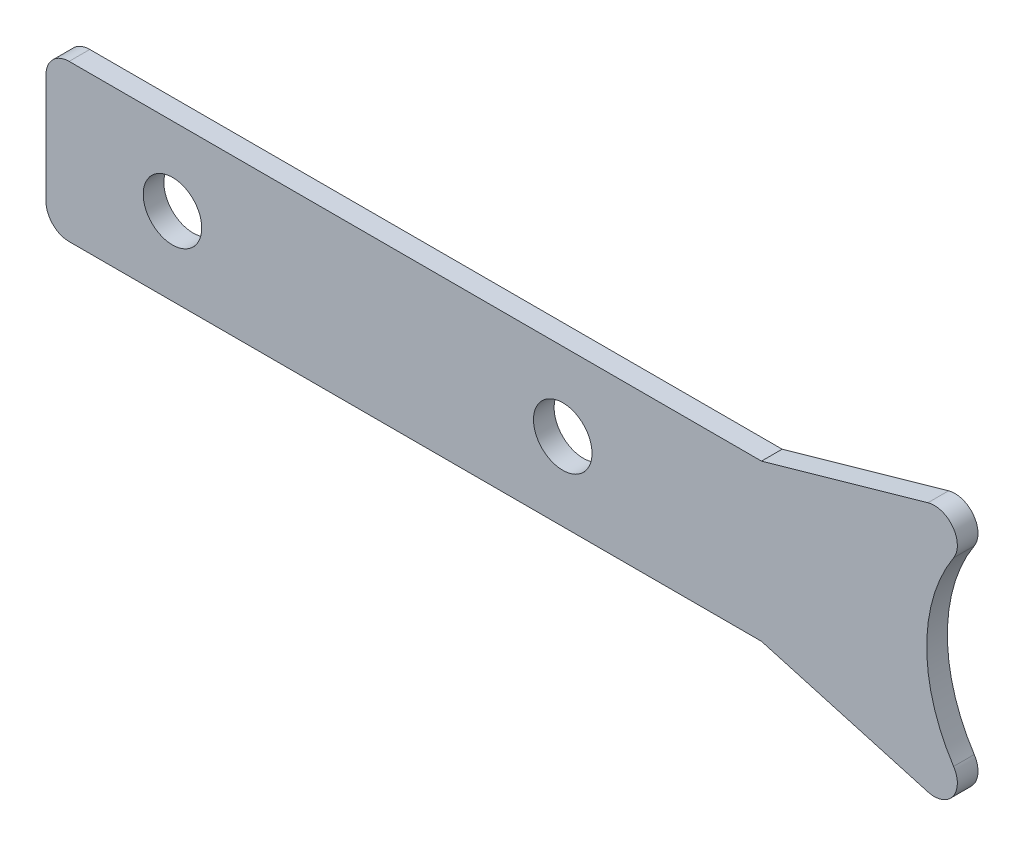
ISO-10303-21;
HEADER;
FILE_DESCRIPTION(('STEP AP214'),'2;1');
FILE_NAME('part.step','',(''),(''),'','','');
FILE_SCHEMA(('AUTOMOTIVE_DESIGN { 1 0 10303 214 1 1 1 1 }'));
ENDSEC;
DATA;
#1=APPLICATION_CONTEXT('core data for automotive mechanical design processes');
#2=APPLICATION_PROTOCOL_DEFINITION('international standard','automotive_design',2000,#1);
#3=PRODUCT_CONTEXT('',#1,'mechanical');
#4=PRODUCT('Part','Part','',(#3));
#5=PRODUCT_RELATED_PRODUCT_CATEGORY('part','',(#4));
#6=PRODUCT_DEFINITION_FORMATION('','',#4);
#7=PRODUCT_DEFINITION_CONTEXT('part definition',#1,'design');
#8=PRODUCT_DEFINITION('design','',#6,#7);
#9=PRODUCT_DEFINITION_SHAPE('','',#8);
#10=(LENGTH_UNIT() NAMED_UNIT(*) SI_UNIT(.MILLI.,.METRE.));
#11=(NAMED_UNIT(*) PLANE_ANGLE_UNIT() SI_UNIT($,.RADIAN.));
#12=(NAMED_UNIT(*) SI_UNIT($,.STERADIAN.) SOLID_ANGLE_UNIT());
#13=UNCERTAINTY_MEASURE_WITH_UNIT(LENGTH_MEASURE(1.E-05),#10,'distance_accuracy_value','');
#14=(GEOMETRIC_REPRESENTATION_CONTEXT(3) GLOBAL_UNCERTAINTY_ASSIGNED_CONTEXT((#13)) GLOBAL_UNIT_ASSIGNED_CONTEXT((#10,
#11,#12)) REPRESENTATION_CONTEXT('',''));
#15=CARTESIAN_POINT('',(0.,0.,0.));
#16=DIRECTION('',(0.,0.,1.));
#17=DIRECTION('',(1.,0.,0.));
#18=AXIS2_PLACEMENT_3D('',#15,#16,#17);
#19=CARTESIAN_POINT('',(0.,-5.99999999999999,1.5875));
#20=DIRECTION('',(0.,1.,0.));
#21=DIRECTION('',(-1.,0.,0.));
#22=AXIS2_PLACEMENT_3D('',#19,#20,#21);
#23=PLANE('',#22);
#24=DIRECTION('',(1.,0.,0.));
#25=VECTOR('',#24,1.);
#26=CARTESIAN_POINT('',(0.,-5.99999999999999,1.5875));
#27=LINE('',#26,#25);
#28=CARTESIAN_POINT('',(-25.722,-5.99999999999999,1.5875));
#29=VERTEX_POINT('',#28);
#30=CARTESIAN_POINT('',(27.5,-5.99999999999999,1.5875));
#31=VERTEX_POINT('',#30);
#32=EDGE_CURVE('E118',#29,#31,#27,.T.);
#33=ORIENTED_EDGE('',*,*,#32,.F.);
#34=DIRECTION('',(0.,0.,-1.));
#35=VECTOR('',#34,1.);
#36=CARTESIAN_POINT('',(-25.722,-5.99999999999999,1.5875));
#37=LINE('',#36,#35);
#38=CARTESIAN_POINT('',(-25.722,-5.99999999999999,0.));
#39=VERTEX_POINT('',#38);
#40=EDGE_CURVE('E170',#29,#39,#37,.T.);
#41=ORIENTED_EDGE('',*,*,#40,.T.);
#42=DIRECTION('',(1.,0.,0.));
#43=VECTOR('',#42,1.);
#44=CARTESIAN_POINT('',(0.,-5.99999999999999,0.));
#45=LINE('',#44,#43);
#46=CARTESIAN_POINT('',(27.5,-5.99999999999999,0.));
#47=VERTEX_POINT('',#46);
#48=EDGE_CURVE('E141',#39,#47,#45,.T.);
#49=ORIENTED_EDGE('',*,*,#48,.T.);
#50=DIRECTION('',(0.,0.,-1.));
#51=VECTOR('',#50,1.);
#52=CARTESIAN_POINT('',(27.5,-5.99999999999999,1.5875));
#53=LINE('',#52,#51);
#54=EDGE_CURVE('E136',#31,#47,#53,.T.);
#55=ORIENTED_EDGE('',*,*,#54,.F.);
#56=EDGE_LOOP('',(#33,#41,#49,#55));
#57=FACE_BOUND('',#56,.T.);
#58=ADVANCED_FACE('F41',(#57),#23,.F.);
#59=CARTESIAN_POINT('',(0.471196369912485,1.66217483086752,1.5875));
#60=DIRECTION('',(0.272734823959904,0.962089245236407,0.));
#61=DIRECTION('',(-0.962089245236408,0.272734823959904,0.));
#62=AXIS2_PLACEMENT_3D('',#59,#60,#61);
#63=PLANE('',#62);
#64=DIRECTION('',(0.962089245236407,-0.272734823959904,0.));
#65=VECTOR('',#64,1.);
#66=CARTESIAN_POINT('',(0.471196369912485,1.66217483086752,0.));
#67=LINE('',#66,#65);
#68=CARTESIAN_POINT('',(40.2927545745257,-9.62651353200419,0.));
#69=VERTEX_POINT('',#68);
#70=EDGE_CURVE('E189',#47,#69,#67,.T.);
#71=ORIENTED_EDGE('',*,*,#70,.T.);
#72=DIRECTION('',(0.,0.,1.));
#73=VECTOR('',#72,1.);
#74=CARTESIAN_POINT('',(40.2927545745257,-9.62651353200419,1.5875));
#75=LINE('',#74,#73);
#76=CARTESIAN_POINT('',(40.2927545745257,-9.62651353200419,1.5875));
#77=VERTEX_POINT('',#76);
#78=EDGE_CURVE('E49',#69,#77,#75,.T.);
#79=ORIENTED_EDGE('',*,*,#78,.T.);
#80=DIRECTION('',(0.962089245236407,-0.272734823959904,0.));
#81=VECTOR('',#80,1.);
#82=CARTESIAN_POINT('',(0.471196369912485,1.66217483086752,1.5875));
#83=LINE('',#82,#81);
#84=EDGE_CURVE('E122',#31,#77,#83,.T.);
#85=ORIENTED_EDGE('',*,*,#84,.F.);
#86=ORIENTED_EDGE('',*,*,#54,.T.);
#87=EDGE_LOOP('',(#71,#79,#85,#86));
#88=FACE_BOUND('',#87,.T.);
#89=ADVANCED_FACE('F135',(#88),#63,.F.);
#90=CARTESIAN_POINT('',(52.9,0.,1.5875));
#91=DIRECTION('',(0.,0.,-1.));
#92=DIRECTION('',(-1.,0.,0.));
#93=AXIS2_PLACEMENT_3D('',#90,#91,#92);
#94=CYLINDRICAL_SURFACE('',#93,12.7);
#95=CARTESIAN_POINT('',(52.9,0.,1.5875));
#96=DIRECTION('',(0.,0.,1.));
#97=DIRECTION('',(1.,0.,0.));
#98=AXIS2_PLACEMENT_3D('',#95,#96,#97);
#99=CIRCLE('',#98,12.7);
#100=CARTESIAN_POINT('',(42.2663834136197,6.94378846839813,1.5875));
#101=VERTEX_POINT('',#100);
#102=CARTESIAN_POINT('',(42.2663834136197,-6.94378846839812,1.5875));
#103=VERTEX_POINT('',#102);
#104=EDGE_CURVE('E138',#101,#103,#99,.T.);
#105=ORIENTED_EDGE('',*,*,#104,.T.);
#106=DIRECTION('',(0.,0.,-1.));
#107=VECTOR('',#106,1.);
#108=CARTESIAN_POINT('',(42.2663834136197,-6.94378846839812,1.5875));
#109=LINE('',#108,#107);
#110=CARTESIAN_POINT('',(42.2663834136197,-6.94378846839812,0.));
#111=VERTEX_POINT('',#110);
#112=EDGE_CURVE('E174',#103,#111,#109,.T.);
#113=ORIENTED_EDGE('',*,*,#112,.T.);
#114=CARTESIAN_POINT('',(52.9,0.,0.));
#115=DIRECTION('',(0.,0.,1.));
#116=DIRECTION('',(1.,0.,0.));
#117=AXIS2_PLACEMENT_3D('',#114,#115,#116);
#118=CIRCLE('',#117,12.7);
#119=CARTESIAN_POINT('',(42.2663834136197,6.94378846839813,0.));
#120=VERTEX_POINT('',#119);
#121=EDGE_CURVE('E181',#120,#111,#118,.T.);
#122=ORIENTED_EDGE('',*,*,#121,.F.);
#123=DIRECTION('',(0.,0.,-1.));
#124=VECTOR('',#123,1.);
#125=CARTESIAN_POINT('',(42.2663834136197,6.94378846839812,1.5875));
#126=LINE('',#125,#124);
#127=EDGE_CURVE('E172',#120,#101,#126,.F.);
#128=ORIENTED_EDGE('',*,*,#127,.T.);
#129=EDGE_LOOP('',(#105,#113,#122,#128));
#130=FACE_BOUND('',#129,.T.);
#131=ADVANCED_FACE('F180',(#130),#94,.F.);
#132=CARTESIAN_POINT('',(0.471196369912486,-1.66217483086753,1.5875));
#133=DIRECTION('',(-0.272734823959904,0.962089245236407,0.));
#134=DIRECTION('',(-0.962089245236408,-0.272734823959904,0.));
#135=AXIS2_PLACEMENT_3D('',#132,#133,#134);
#136=PLANE('',#135);
#137=DIRECTION('',(0.962089245236407,0.272734823959904,0.));
#138=VECTOR('',#137,1.);
#139=CARTESIAN_POINT('',(0.471196369912486,-1.66217483086753,1.5875));
#140=LINE('',#139,#138);
#141=CARTESIAN_POINT('',(27.5,5.99999999999999,1.5875));
#142=VERTEX_POINT('',#141);
#143=CARTESIAN_POINT('',(40.2927545745257,9.62651353200419,1.5875));
#144=VERTEX_POINT('',#143);
#145=EDGE_CURVE('E212',#142,#144,#140,.T.);
#146=ORIENTED_EDGE('',*,*,#145,.T.);
#147=DIRECTION('',(0.,0.,-1.));
#148=VECTOR('',#147,1.);
#149=CARTESIAN_POINT('',(40.2927545745257,9.62651353200419,1.5875));
#150=LINE('',#149,#148);
#151=CARTESIAN_POINT('',(40.2927545745257,9.62651353200419,0.));
#152=VERTEX_POINT('',#151);
#153=EDGE_CURVE('E11',#144,#152,#150,.T.);
#154=ORIENTED_EDGE('',*,*,#153,.T.);
#155=DIRECTION('',(0.962089245236407,0.272734823959904,0.));
#156=VECTOR('',#155,1.);
#157=CARTESIAN_POINT('',(0.471196369912486,-1.66217483086753,0.));
#158=LINE('',#157,#156);
#159=CARTESIAN_POINT('',(27.5,5.99999999999999,0.));
#160=VERTEX_POINT('',#159);
#161=EDGE_CURVE('E188',#160,#152,#158,.T.);
#162=ORIENTED_EDGE('',*,*,#161,.F.);
#163=DIRECTION('',(0.,0.,-1.));
#164=VECTOR('',#163,1.);
#165=CARTESIAN_POINT('',(27.5,5.99999999999999,1.5875));
#166=LINE('',#165,#164);
#167=EDGE_CURVE('E144',#142,#160,#166,.T.);
#168=ORIENTED_EDGE('',*,*,#167,.F.);
#169=EDGE_LOOP('',(#146,#154,#162,#168));
#170=FACE_BOUND('',#169,.T.);
#171=ADVANCED_FACE('F320',(#170),#136,.T.);
#172=CARTESIAN_POINT('',(0.,6.,1.5875));
#173=DIRECTION('',(0.,1.,0.));
#174=DIRECTION('',(-1.,0.,0.));
#175=AXIS2_PLACEMENT_3D('',#172,#173,#174);
#176=PLANE('',#175);
#177=DIRECTION('',(1.,0.,0.));
#178=VECTOR('',#177,1.);
#179=CARTESIAN_POINT('',(0.,6.,0.));
#180=LINE('',#179,#178);
#181=CARTESIAN_POINT('',(-25.722,6.00000000000001,0.));
#182=VERTEX_POINT('',#181);
#183=EDGE_CURVE('E191',#182,#160,#180,.T.);
#184=ORIENTED_EDGE('',*,*,#183,.F.);
#185=DIRECTION('',(0.,0.,-1.));
#186=VECTOR('',#185,1.);
#187=CARTESIAN_POINT('',(-25.722,6.00000000000001,1.5875));
#188=LINE('',#187,#186);
#189=CARTESIAN_POINT('',(-25.722,6.00000000000001,1.5875));
#190=VERTEX_POINT('',#189);
#191=EDGE_CURVE('E163',#182,#190,#188,.F.);
#192=ORIENTED_EDGE('',*,*,#191,.T.);
#193=DIRECTION('',(1.,0.,0.));
#194=VECTOR('',#193,1.);
#195=CARTESIAN_POINT('',(0.,6.,1.5875));
#196=LINE('',#195,#194);
#197=EDGE_CURVE('E210',#190,#142,#196,.T.);
#198=ORIENTED_EDGE('',*,*,#197,.T.);
#199=ORIENTED_EDGE('',*,*,#167,.T.);
#200=EDGE_LOOP('',(#184,#192,#198,#199));
#201=FACE_BOUND('',#200,.T.);
#202=ADVANCED_FACE('F312',(#201),#176,.T.);
#203=CARTESIAN_POINT('',(-27.5,0.,1.5875));
#204=DIRECTION('',(1.,0.,0.));
#205=DIRECTION('',(0.,1.,0.));
#206=AXIS2_PLACEMENT_3D('',#203,#204,#205);
#207=PLANE('',#206);
#208=DIRECTION('',(0.,-1.,0.));
#209=VECTOR('',#208,1.);
#210=CARTESIAN_POINT('',(-27.5,0.,1.5875));
#211=LINE('',#210,#209);
#212=CARTESIAN_POINT('',(-27.5,4.22200000000001,1.5875));
#213=VERTEX_POINT('',#212);
#214=CARTESIAN_POINT('',(-27.5,-4.22199999999999,1.5875));
#215=VERTEX_POINT('',#214);
#216=EDGE_CURVE('E149',#213,#215,#211,.T.);
#217=ORIENTED_EDGE('',*,*,#216,.F.);
#218=DIRECTION('',(0.,0.,-1.));
#219=VECTOR('',#218,1.);
#220=CARTESIAN_POINT('',(-27.5,4.22200000000001,0.));
#221=LINE('',#220,#219);
#222=CARTESIAN_POINT('',(-27.5,4.22200000000001,0.));
#223=VERTEX_POINT('',#222);
#224=EDGE_CURVE('E146',#213,#223,#221,.T.);
#225=ORIENTED_EDGE('',*,*,#224,.T.);
#226=DIRECTION('',(0.,-1.,0.));
#227=VECTOR('',#226,1.);
#228=CARTESIAN_POINT('',(-27.5,0.,0.));
#229=LINE('',#228,#227);
#230=CARTESIAN_POINT('',(-27.5,-4.22199999999999,0.));
#231=VERTEX_POINT('',#230);
#232=EDGE_CURVE('E130',#223,#231,#229,.T.);
#233=ORIENTED_EDGE('',*,*,#232,.T.);
#234=DIRECTION('',(0.,0.,-1.));
#235=VECTOR('',#234,1.);
#236=CARTESIAN_POINT('',(-27.5,-4.22199999999999,1.5875));
#237=LINE('',#236,#235);
#238=EDGE_CURVE('E143',#231,#215,#237,.F.);
#239=ORIENTED_EDGE('',*,*,#238,.T.);
#240=EDGE_LOOP('',(#217,#225,#233,#239));
#241=FACE_BOUND('',#240,.T.);
#242=ADVANCED_FACE('F200',(#241),#207,.F.);
#243=CARTESIAN_POINT('',(0.,0.,1.5875));
#244=DIRECTION('',(0.,0.,1.));
#245=DIRECTION('',(1.,0.,0.));
#246=AXIS2_PLACEMENT_3D('',#243,#244,#245);
#247=PLANE('',#246);
#248=CARTESIAN_POINT('',(-17.778,0.,1.5875));
#249=DIRECTION('',(0.,0.,1.));
#250=DIRECTION('',(1.,0.,0.));
#251=AXIS2_PLACEMENT_3D('',#248,#249,#250);
#252=CIRCLE('',#251,2.25);
#253=CARTESIAN_POINT('',(-15.528,0.,1.5875));
#254=VERTEX_POINT('',#253);
#255=EDGE_CURVE('E220',#254,#254,#252,.T.);
#256=ORIENTED_EDGE('',*,*,#255,.F.);
#257=EDGE_LOOP('',(#256));
#258=FACE_BOUND('',#257,.T.);
#259=CARTESIAN_POINT('',(12.2216508138959,0.,1.5875));
#260=DIRECTION('',(0.,0.,1.));
#261=DIRECTION('',(1.,0.,0.));
#262=AXIS2_PLACEMENT_3D('',#259,#260,#261);
#263=CIRCLE('',#262,2.25);
#264=CARTESIAN_POINT('',(14.4716508138959,0.,1.5875));
#265=VERTEX_POINT('',#264);
#266=EDGE_CURVE('E206',#265,#265,#263,.T.);
#267=ORIENTED_EDGE('',*,*,#266,.F.);
#268=EDGE_LOOP('',(#267));
#269=FACE_BOUND('',#268,.T.);
#270=ORIENTED_EDGE('',*,*,#197,.F.);
#271=CARTESIAN_POINT('',(-25.722,4.22200000000001,1.5875));
#272=DIRECTION('',(0.,0.,1.));
#273=DIRECTION('',(1.,0.,0.));
#274=AXIS2_PLACEMENT_3D('',#271,#272,#273);
#275=CIRCLE('',#274,1.778);
#276=EDGE_CURVE('E168',#190,#213,#275,.T.);
#277=ORIENTED_EDGE('',*,*,#276,.T.);
#278=ORIENTED_EDGE('',*,*,#216,.T.);
#279=CARTESIAN_POINT('',(-25.722,-4.22199999999999,1.5875));
#280=DIRECTION('',(0.,0.,1.));
#281=DIRECTION('',(1.,0.,0.));
#282=AXIS2_PLACEMENT_3D('',#279,#280,#281);
#283=CIRCLE('',#282,1.778);
#284=EDGE_CURVE('E125',#215,#29,#283,.T.);
#285=ORIENTED_EDGE('',*,*,#284,.T.);
#286=ORIENTED_EDGE('',*,*,#32,.T.);
#287=ORIENTED_EDGE('',*,*,#84,.T.);
#288=CARTESIAN_POINT('',(40.7776770915264,-7.91591885397385,1.5875));
#289=DIRECTION('',(0.,0.,1.));
#290=DIRECTION('',(1.,0.,0.));
#291=AXIS2_PLACEMENT_3D('',#288,#289,#290);
#292=CIRCLE('',#291,1.778);
#293=EDGE_CURVE('E62',#77,#103,#292,.T.);
#294=ORIENTED_EDGE('',*,*,#293,.T.);
#295=ORIENTED_EDGE('',*,*,#104,.F.);
#296=CARTESIAN_POINT('',(40.7776770915265,7.91591885397386,1.5875));
#297=DIRECTION('',(0.,0.,1.));
#298=DIRECTION('',(1.,0.,0.));
#299=AXIS2_PLACEMENT_3D('',#296,#297,#298);
#300=CIRCLE('',#299,1.778);
#301=EDGE_CURVE('E56',#101,#144,#300,.T.);
#302=ORIENTED_EDGE('',*,*,#301,.T.);
#303=ORIENTED_EDGE('',*,*,#145,.F.);
#304=EDGE_LOOP('',(#270,#277,#278,#285,#286,#287,#294,#295,#302,#303));
#305=FACE_BOUND('',#304,.T.);
#306=ADVANCED_FACE('F121',(#258,#269,#305),#247,.T.);
#307=CARTESIAN_POINT('',(0.,0.,0.));
#308=DIRECTION('',(0.,0.,1.));
#309=DIRECTION('',(1.,0.,0.));
#310=AXIS2_PLACEMENT_3D('',#307,#308,#309);
#311=PLANE('',#310);
#312=CARTESIAN_POINT('',(-17.778,0.,0.));
#313=DIRECTION('',(0.,0.,1.));
#314=DIRECTION('',(1.,0.,0.));
#315=AXIS2_PLACEMENT_3D('',#312,#313,#314);
#316=CIRCLE('',#315,2.25);
#317=CARTESIAN_POINT('',(-15.528,0.,0.));
#318=VERTEX_POINT('',#317);
#319=EDGE_CURVE('E217',#318,#318,#316,.T.);
#320=ORIENTED_EDGE('',*,*,#319,.T.);
#321=EDGE_LOOP('',(#320));
#322=FACE_BOUND('',#321,.T.);
#323=CARTESIAN_POINT('',(12.2216508138959,0.,0.));
#324=DIRECTION('',(0.,0.,1.));
#325=DIRECTION('',(1.,0.,0.));
#326=AXIS2_PLACEMENT_3D('',#323,#324,#325);
#327=CIRCLE('',#326,2.25);
#328=CARTESIAN_POINT('',(14.4716508138959,0.,0.));
#329=VERTEX_POINT('',#328);
#330=EDGE_CURVE('E204',#329,#329,#327,.T.);
#331=ORIENTED_EDGE('',*,*,#330,.T.);
#332=EDGE_LOOP('',(#331));
#333=FACE_BOUND('',#332,.T.);
#334=ORIENTED_EDGE('',*,*,#232,.F.);
#335=CARTESIAN_POINT('',(-25.722,4.22200000000001,0.));
#336=DIRECTION('',(0.,0.,1.));
#337=DIRECTION('',(1.,0.,0.));
#338=AXIS2_PLACEMENT_3D('',#335,#336,#337);
#339=CIRCLE('',#338,1.778);
#340=EDGE_CURVE('E161',#223,#182,#339,.F.);
#341=ORIENTED_EDGE('',*,*,#340,.T.);
#342=ORIENTED_EDGE('',*,*,#183,.T.);
#343=ORIENTED_EDGE('',*,*,#161,.T.);
#344=CARTESIAN_POINT('',(40.7776770915265,7.91591885397386,0.));
#345=DIRECTION('',(0.,0.,1.));
#346=DIRECTION('',(1.,0.,0.));
#347=AXIS2_PLACEMENT_3D('',#344,#345,#346);
#348=CIRCLE('',#347,1.778);
#349=EDGE_CURVE('E155',#152,#120,#348,.F.);
#350=ORIENTED_EDGE('',*,*,#349,.T.);
#351=ORIENTED_EDGE('',*,*,#121,.T.);
#352=CARTESIAN_POINT('',(40.7776770915264,-7.91591885397385,0.));
#353=DIRECTION('',(0.,0.,1.));
#354=DIRECTION('',(1.,0.,0.));
#355=AXIS2_PLACEMENT_3D('',#352,#353,#354);
#356=CIRCLE('',#355,1.778);
#357=EDGE_CURVE('E157',#111,#69,#356,.F.);
#358=ORIENTED_EDGE('',*,*,#357,.T.);
#359=ORIENTED_EDGE('',*,*,#70,.F.);
#360=ORIENTED_EDGE('',*,*,#48,.F.);
#361=CARTESIAN_POINT('',(-25.722,-4.22199999999999,0.));
#362=DIRECTION('',(0.,0.,1.));
#363=DIRECTION('',(1.,0.,0.));
#364=AXIS2_PLACEMENT_3D('',#361,#362,#363);
#365=CIRCLE('',#364,1.778);
#366=EDGE_CURVE('E159',#39,#231,#365,.F.);
#367=ORIENTED_EDGE('',*,*,#366,.T.);
#368=EDGE_LOOP('',(#334,#341,#342,#343,#350,#351,#358,#359,#360,#367));
#369=FACE_BOUND('',#368,.T.);
#370=ADVANCED_FACE('F186',(#322,#333,#369),#311,.F.);
#371=CARTESIAN_POINT('',(-25.722,4.22200000000001,1.5875));
#372=DIRECTION('',(0.,0.,1.));
#373=DIRECTION('',(1.,0.,0.));
#374=AXIS2_PLACEMENT_3D('',#371,#372,#373);
#375=CYLINDRICAL_SURFACE('',#374,1.778);
#376=ORIENTED_EDGE('',*,*,#276,.F.);
#377=ORIENTED_EDGE('',*,*,#191,.F.);
#378=ORIENTED_EDGE('',*,*,#340,.F.);
#379=ORIENTED_EDGE('',*,*,#224,.F.);
#380=EDGE_LOOP('',(#376,#377,#378,#379));
#381=FACE_BOUND('',#380,.T.);
#382=ADVANCED_FACE('F253',(#381),#375,.T.);
#383=CARTESIAN_POINT('',(-25.722,-4.22199999999999,1.5875));
#384=DIRECTION('',(0.,0.,-1.));
#385=DIRECTION('',(-1.,0.,0.));
#386=AXIS2_PLACEMENT_3D('',#383,#384,#385);
#387=CYLINDRICAL_SURFACE('',#386,1.778);
#388=ORIENTED_EDGE('',*,*,#284,.F.);
#389=ORIENTED_EDGE('',*,*,#238,.F.);
#390=ORIENTED_EDGE('',*,*,#366,.F.);
#391=ORIENTED_EDGE('',*,*,#40,.F.);
#392=EDGE_LOOP('',(#388,#389,#390,#391));
#393=FACE_BOUND('',#392,.T.);
#394=ADVANCED_FACE('F203',(#393),#387,.T.);
#395=CARTESIAN_POINT('',(40.7776770915264,-7.91591885397385,1.5875));
#396=DIRECTION('',(0.,0.,-1.));
#397=DIRECTION('',(-1.,0.,0.));
#398=AXIS2_PLACEMENT_3D('',#395,#396,#397);
#399=CYLINDRICAL_SURFACE('',#398,1.778);
#400=ORIENTED_EDGE('',*,*,#293,.F.);
#401=ORIENTED_EDGE('',*,*,#78,.F.);
#402=ORIENTED_EDGE('',*,*,#357,.F.);
#403=ORIENTED_EDGE('',*,*,#112,.F.);
#404=EDGE_LOOP('',(#400,#401,#402,#403));
#405=FACE_BOUND('',#404,.T.);
#406=ADVANCED_FACE('F242',(#405),#399,.T.);
#407=CARTESIAN_POINT('',(40.7776770915265,7.91591885397386,1.5875));
#408=DIRECTION('',(0.,0.,-1.));
#409=DIRECTION('',(-1.,0.,0.));
#410=AXIS2_PLACEMENT_3D('',#407,#408,#409);
#411=CYLINDRICAL_SURFACE('',#410,1.778);
#412=ORIENTED_EDGE('',*,*,#301,.F.);
#413=ORIENTED_EDGE('',*,*,#127,.F.);
#414=ORIENTED_EDGE('',*,*,#349,.F.);
#415=ORIENTED_EDGE('',*,*,#153,.F.);
#416=EDGE_LOOP('',(#412,#413,#414,#415));
#417=FACE_BOUND('',#416,.T.);
#418=ADVANCED_FACE('F43',(#417),#411,.T.);
#419=CARTESIAN_POINT('',(12.2216508138959,0.,1.5875));
#420=DIRECTION('',(0.,0.,1.));
#421=DIRECTION('',(1.,0.,0.));
#422=AXIS2_PLACEMENT_3D('',#419,#420,#421);
#423=CYLINDRICAL_SURFACE('',#422,2.25);
#424=ORIENTED_EDGE('',*,*,#330,.F.);
#425=EDGE_LOOP('',(#424));
#426=FACE_BOUND('',#425,.T.);
#427=ORIENTED_EDGE('',*,*,#266,.T.);
#428=EDGE_LOOP('',(#427));
#429=FACE_BOUND('',#428,.T.);
#430=ADVANCED_FACE('F231',(#426,#429),#423,.F.);
#431=CARTESIAN_POINT('',(-17.778,0.,1.5875));
#432=DIRECTION('',(0.,0.,1.));
#433=DIRECTION('',(1.,0.,0.));
#434=AXIS2_PLACEMENT_3D('',#431,#432,#433);
#435=CYLINDRICAL_SURFACE('',#434,2.25);
#436=ORIENTED_EDGE('',*,*,#319,.F.);
#437=EDGE_LOOP('',(#436));
#438=FACE_BOUND('',#437,.T.);
#439=ORIENTED_EDGE('',*,*,#255,.T.);
#440=EDGE_LOOP('',(#439));
#441=FACE_BOUND('',#440,.T.);
#442=ADVANCED_FACE('F224',(#438,#441),#435,.F.);
#443=CLOSED_SHELL('',(#58,#89,#131,#171,#202,#242,#306,#370,#382,#394,#406,#418,#430,#442));
#444=MANIFOLD_SOLID_BREP('B2',#443);
#445=ADVANCED_BREP_SHAPE_REPRESENTATION('',(#18,#444),#14);
#446=SHAPE_DEFINITION_REPRESENTATION(#9,#445);
ENDSEC;
END-ISO-10303-21;
